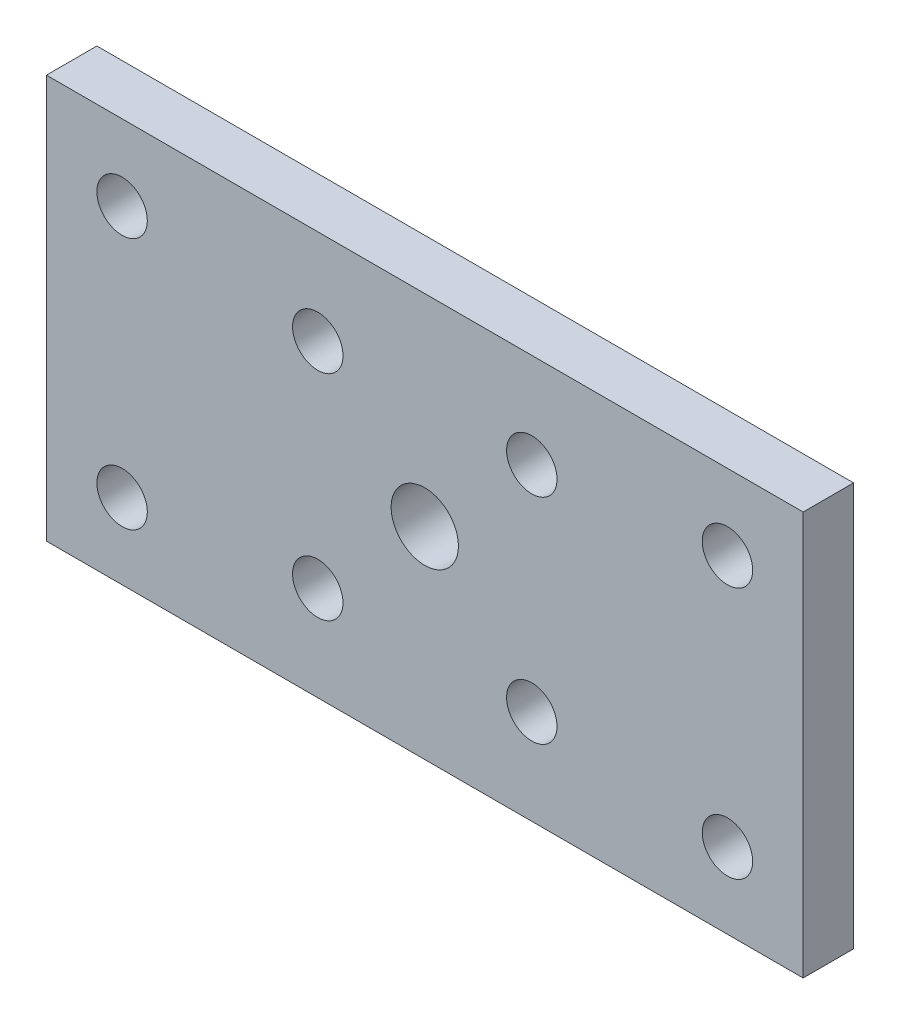
ISO-10303-21;
HEADER;
FILE_DESCRIPTION(('STEP AP214'),'2;1');
FILE_NAME('part.step','',(''),(''),'','','');
FILE_SCHEMA(('AUTOMOTIVE_DESIGN { 1 0 10303 214 1 1 1 1 }'));
ENDSEC;
DATA;
#1=APPLICATION_CONTEXT('core data for automotive mechanical design processes');
#2=APPLICATION_PROTOCOL_DEFINITION('international standard','automotive_design',2000,#1);
#3=PRODUCT_CONTEXT('',#1,'mechanical');
#4=PRODUCT('Part','Part','',(#3));
#5=PRODUCT_RELATED_PRODUCT_CATEGORY('part','',(#4));
#6=PRODUCT_DEFINITION_FORMATION('','',#4);
#7=PRODUCT_DEFINITION_CONTEXT('part definition',#1,'design');
#8=PRODUCT_DEFINITION('design','',#6,#7);
#9=PRODUCT_DEFINITION_SHAPE('','',#8);
#10=(LENGTH_UNIT() NAMED_UNIT(*) SI_UNIT(.MILLI.,.METRE.));
#11=(NAMED_UNIT(*) PLANE_ANGLE_UNIT() SI_UNIT($,.RADIAN.));
#12=(NAMED_UNIT(*) SI_UNIT($,.STERADIAN.) SOLID_ANGLE_UNIT());
#13=UNCERTAINTY_MEASURE_WITH_UNIT(LENGTH_MEASURE(1.E-05),#10,'distance_accuracy_value','');
#14=(GEOMETRIC_REPRESENTATION_CONTEXT(3) GLOBAL_UNCERTAINTY_ASSIGNED_CONTEXT((#13)) GLOBAL_UNIT_ASSIGNED_CONTEXT((#10,
#11,#12)) REPRESENTATION_CONTEXT('',''));
#15=CARTESIAN_POINT('',(0.,0.,0.));
#16=DIRECTION('',(0.,0.,1.));
#17=DIRECTION('',(1.,0.,0.));
#18=AXIS2_PLACEMENT_3D('',#15,#16,#17);
#19=CARTESIAN_POINT('',(0.,0.,3.));
#20=DIRECTION('',(0.,0.,1.));
#21=DIRECTION('',(1.,0.,0.));
#22=AXIS2_PLACEMENT_3D('',#19,#20,#21);
#23=PLANE('',#22);
#24=CARTESIAN_POINT('',(133.4855939853,225.0370579951,3.));
#25=DIRECTION('',(0.,0.,1.));
#26=DIRECTION('',(1.,0.,0.));
#27=AXIS2_PLACEMENT_3D('',#24,#25,#26);
#28=CIRCLE('',#27,1.5);
#29=CARTESIAN_POINT('',(134.9855939853,225.0370579951,3.));
#30=VERTEX_POINT('',#29);
#31=EDGE_CURVE('E151',#30,#30,#28,.T.);
#32=ORIENTED_EDGE('',*,*,#31,.F.);
#33=EDGE_LOOP('',(#32));
#34=FACE_BOUND('',#33,.T.);
#35=CARTESIAN_POINT('',(97.4855939853,225.0370666408,3.));
#36=DIRECTION('',(0.,0.,1.));
#37=DIRECTION('',(1.,0.,0.));
#38=AXIS2_PLACEMENT_3D('',#35,#36,#37);
#39=CIRCLE('',#38,1.5);
#40=CARTESIAN_POINT('',(98.9855939853,225.0370666408,3.));
#41=VERTEX_POINT('',#40);
#42=EDGE_CURVE('E139',#41,#41,#39,.T.);
#43=ORIENTED_EDGE('',*,*,#42,.F.);
#44=EDGE_LOOP('',(#43));
#45=FACE_BOUND('',#44,.T.);
#46=CARTESIAN_POINT('',(109.1216329546,211.1731012873,3.));
#47=DIRECTION('',(0.,0.,1.));
#48=DIRECTION('',(1.,0.,0.));
#49=AXIS2_PLACEMENT_3D('',#46,#47,#48);
#50=CIRCLE('',#49,1.5);
#51=CARTESIAN_POINT('',(110.6216329546,211.1731012873,3.));
#52=VERTEX_POINT('',#51);
#53=EDGE_CURVE('E127',#52,#52,#50,.T.);
#54=ORIENTED_EDGE('',*,*,#53,.F.);
#55=EDGE_LOOP('',(#54));
#56=FACE_BOUND('',#55,.T.);
#57=CARTESIAN_POINT('',(121.849555016,211.1731012873,3.));
#58=DIRECTION('',(0.,0.,1.));
#59=DIRECTION('',(1.,0.,0.));
#60=AXIS2_PLACEMENT_3D('',#57,#58,#59);
#61=CIRCLE('',#60,1.5);
#62=CARTESIAN_POINT('',(123.349555016,211.1731012873,3.));
#63=VERTEX_POINT('',#62);
#64=EDGE_CURVE('E115',#63,#63,#61,.T.);
#65=ORIENTED_EDGE('',*,*,#64,.F.);
#66=EDGE_LOOP('',(#65));
#67=FACE_BOUND('',#66,.T.);
#68=DIRECTION('',(0.,-1.,0.));
#69=VECTOR('',#68,1.);
#70=CARTESIAN_POINT('',(92.9855939853,229.5370666408,3.));
#71=LINE('',#70,#69);
#72=CARTESIAN_POINT('',(92.9855939853,229.5370666408,3.));
#73=VERTEX_POINT('',#72);
#74=CARTESIAN_POINT('',(92.9855939853,205.5370666408,3.));
#75=VERTEX_POINT('',#74);
#76=EDGE_CURVE('E85',#73,#75,#71,.T.);
#77=ORIENTED_EDGE('',*,*,#76,.T.);
#78=DIRECTION('',(0.999999999999982,-1.92126665811263E-07,0.));
#79=VECTOR('',#78,1.);
#80=CARTESIAN_POINT('',(92.9855939853,205.5370666408,3.));
#81=LINE('',#80,#79);
#82=CARTESIAN_POINT('',(137.9855939853,205.5370579951,3.));
#83=VERTEX_POINT('',#82);
#84=EDGE_CURVE('E80',#75,#83,#81,.T.);
#85=ORIENTED_EDGE('',*,*,#84,.T.);
#86=DIRECTION('',(0.,1.,0.));
#87=VECTOR('',#86,1.);
#88=CARTESIAN_POINT('',(137.9855939853,205.5370579951,3.));
#89=LINE('',#88,#87);
#90=CARTESIAN_POINT('',(137.9855939853,229.5370579951,3.));
#91=VERTEX_POINT('',#90);
#92=EDGE_CURVE('E83',#83,#91,#89,.T.);
#93=ORIENTED_EDGE('',*,*,#92,.T.);
#94=DIRECTION('',(-0.999999999999982,1.92126666428054E-07,0.));
#95=VECTOR('',#94,1.);
#96=CARTESIAN_POINT('',(92.9855939853,229.5370666408,3.));
#97=LINE('',#96,#95);
#98=EDGE_CURVE('E50',#91,#73,#97,.T.);
#99=ORIENTED_EDGE('',*,*,#98,.T.);
#100=EDGE_LOOP('',(#77,#85,#93,#99));
#101=FACE_BOUND('',#100,.T.);
#102=CARTESIAN_POINT('',(109.1216329546,223.9010233486,3.));
#103=DIRECTION('',(0.,0.,1.));
#104=DIRECTION('',(1.,0.,0.));
#105=AXIS2_PLACEMENT_3D('',#102,#103,#104);
#106=CIRCLE('',#105,1.5);
#107=CARTESIAN_POINT('',(110.6216329546,223.9010233486,3.));
#108=VERTEX_POINT('',#107);
#109=EDGE_CURVE('E100',#108,#108,#106,.T.);
#110=ORIENTED_EDGE('',*,*,#109,.F.);
#111=EDGE_LOOP('',(#110));
#112=FACE_BOUND('',#111,.T.);
#113=CARTESIAN_POINT('',(121.849555016,223.9010233486,3.));
#114=DIRECTION('',(0.,0.,1.));
#115=DIRECTION('',(1.,0.,0.));
#116=AXIS2_PLACEMENT_3D('',#113,#114,#115);
#117=CIRCLE('',#116,1.5);
#118=CARTESIAN_POINT('',(123.349555016,223.9010233486,3.));
#119=VERTEX_POINT('',#118);
#120=EDGE_CURVE('E121',#119,#119,#117,.T.);
#121=ORIENTED_EDGE('',*,*,#120,.F.);
#122=EDGE_LOOP('',(#121));
#123=FACE_BOUND('',#122,.T.);
#124=CARTESIAN_POINT('',(115.4855939853,217.537062318,3.));
#125=DIRECTION('',(0.,0.,1.));
#126=DIRECTION('',(1.,0.,0.));
#127=AXIS2_PLACEMENT_3D('',#124,#125,#126);
#128=CIRCLE('',#127,2.);
#129=CARTESIAN_POINT('',(117.4855939853,217.537062318,3.));
#130=VERTEX_POINT('',#129);
#131=EDGE_CURVE('E133',#130,#130,#128,.T.);
#132=ORIENTED_EDGE('',*,*,#131,.F.);
#133=EDGE_LOOP('',(#132));
#134=FACE_BOUND('',#133,.T.);
#135=CARTESIAN_POINT('',(97.4855939853,210.0370666408,3.));
#136=DIRECTION('',(0.,0.,1.));
#137=DIRECTION('',(1.,0.,0.));
#138=AXIS2_PLACEMENT_3D('',#135,#136,#137);
#139=CIRCLE('',#138,1.5);
#140=CARTESIAN_POINT('',(98.9855939853,210.0370666408,3.));
#141=VERTEX_POINT('',#140);
#142=EDGE_CURVE('E145',#141,#141,#139,.T.);
#143=ORIENTED_EDGE('',*,*,#142,.F.);
#144=EDGE_LOOP('',(#143));
#145=FACE_BOUND('',#144,.T.);
#146=CARTESIAN_POINT('',(133.4855939853,210.0370579951,3.));
#147=DIRECTION('',(0.,0.,1.));
#148=DIRECTION('',(1.,0.,0.));
#149=AXIS2_PLACEMENT_3D('',#146,#147,#148);
#150=CIRCLE('',#149,1.5);
#151=CARTESIAN_POINT('',(134.9855939853,210.0370579951,3.));
#152=VERTEX_POINT('',#151);
#153=EDGE_CURVE('E157',#152,#152,#150,.T.);
#154=ORIENTED_EDGE('',*,*,#153,.F.);
#155=EDGE_LOOP('',(#154));
#156=FACE_BOUND('',#155,.T.);
#157=ADVANCED_FACE('F33',(#34,#45,#56,#67,#101,#112,#123,#134,#145,#156),#23,.T.);
#158=CARTESIAN_POINT('',(0.,0.,0.));
#159=DIRECTION('',(0.,0.,1.));
#160=DIRECTION('',(1.,0.,0.));
#161=AXIS2_PLACEMENT_3D('',#158,#159,#160);
#162=PLANE('',#161);
#163=CARTESIAN_POINT('',(133.4855939853,225.0370579951,0.));
#164=DIRECTION('',(0.,0.,1.));
#165=DIRECTION('',(1.,0.,0.));
#166=AXIS2_PLACEMENT_3D('',#163,#164,#165);
#167=CIRCLE('',#166,1.5);
#168=CARTESIAN_POINT('',(134.9855939853,225.0370579951,0.));
#169=VERTEX_POINT('',#168);
#170=EDGE_CURVE('E154',#169,#169,#167,.T.);
#171=ORIENTED_EDGE('',*,*,#170,.T.);
#172=EDGE_LOOP('',(#171));
#173=FACE_BOUND('',#172,.T.);
#174=CARTESIAN_POINT('',(97.4855939853,225.0370666408,0.));
#175=DIRECTION('',(0.,0.,1.));
#176=DIRECTION('',(1.,0.,0.));
#177=AXIS2_PLACEMENT_3D('',#174,#175,#176);
#178=CIRCLE('',#177,1.5);
#179=CARTESIAN_POINT('',(98.9855939853,225.0370666408,0.));
#180=VERTEX_POINT('',#179);
#181=EDGE_CURVE('E142',#180,#180,#178,.T.);
#182=ORIENTED_EDGE('',*,*,#181,.T.);
#183=EDGE_LOOP('',(#182));
#184=FACE_BOUND('',#183,.T.);
#185=CARTESIAN_POINT('',(109.1216329546,211.1731012873,0.));
#186=DIRECTION('',(0.,0.,1.));
#187=DIRECTION('',(1.,0.,0.));
#188=AXIS2_PLACEMENT_3D('',#185,#186,#187);
#189=CIRCLE('',#188,1.5);
#190=CARTESIAN_POINT('',(110.6216329546,211.1731012873,0.));
#191=VERTEX_POINT('',#190);
#192=EDGE_CURVE('E130',#191,#191,#189,.T.);
#193=ORIENTED_EDGE('',*,*,#192,.T.);
#194=EDGE_LOOP('',(#193));
#195=FACE_BOUND('',#194,.T.);
#196=CARTESIAN_POINT('',(121.849555016,211.1731012873,0.));
#197=DIRECTION('',(0.,0.,1.));
#198=DIRECTION('',(1.,0.,0.));
#199=AXIS2_PLACEMENT_3D('',#196,#197,#198);
#200=CIRCLE('',#199,1.5);
#201=CARTESIAN_POINT('',(123.349555016,211.1731012873,0.));
#202=VERTEX_POINT('',#201);
#203=EDGE_CURVE('E118',#202,#202,#200,.T.);
#204=ORIENTED_EDGE('',*,*,#203,.T.);
#205=EDGE_LOOP('',(#204));
#206=FACE_BOUND('',#205,.T.);
#207=DIRECTION('',(0.,-1.,0.));
#208=VECTOR('',#207,1.);
#209=CARTESIAN_POINT('',(92.9855939853,229.5370666408,0.));
#210=LINE('',#209,#208);
#211=CARTESIAN_POINT('',(92.9855939853,229.5370666408,0.));
#212=VERTEX_POINT('',#211);
#213=CARTESIAN_POINT('',(92.9855939853,205.5370666408,0.));
#214=VERTEX_POINT('',#213);
#215=EDGE_CURVE('E97',#212,#214,#210,.T.);
#216=ORIENTED_EDGE('',*,*,#215,.F.);
#217=DIRECTION('',(-0.999999999999982,1.92126666428054E-07,0.));
#218=VECTOR('',#217,1.);
#219=CARTESIAN_POINT('',(92.9855939853,229.5370666408,0.));
#220=LINE('',#219,#218);
#221=CARTESIAN_POINT('',(137.9855939853,229.5370579951,0.));
#222=VERTEX_POINT('',#221);
#223=EDGE_CURVE('E73',#222,#212,#220,.T.);
#224=ORIENTED_EDGE('',*,*,#223,.F.);
#225=DIRECTION('',(0.,1.,0.));
#226=VECTOR('',#225,1.);
#227=CARTESIAN_POINT('',(137.9855939853,205.5370579951,0.));
#228=LINE('',#227,#226);
#229=CARTESIAN_POINT('',(137.9855939853,205.5370579951,0.));
#230=VERTEX_POINT('',#229);
#231=EDGE_CURVE('E67',#230,#222,#228,.T.);
#232=ORIENTED_EDGE('',*,*,#231,.F.);
#233=DIRECTION('',(0.999999999999982,-1.92126665811263E-07,0.));
#234=VECTOR('',#233,1.);
#235=CARTESIAN_POINT('',(92.9855939853,205.5370666408,0.));
#236=LINE('',#235,#234);
#237=EDGE_CURVE('E89',#214,#230,#236,.T.);
#238=ORIENTED_EDGE('',*,*,#237,.F.);
#239=EDGE_LOOP('',(#216,#224,#232,#238));
#240=FACE_BOUND('',#239,.T.);
#241=CARTESIAN_POINT('',(109.1216329546,223.9010233486,0.));
#242=DIRECTION('',(0.,0.,1.));
#243=DIRECTION('',(1.,0.,0.));
#244=AXIS2_PLACEMENT_3D('',#241,#242,#243);
#245=CIRCLE('',#244,1.5);
#246=CARTESIAN_POINT('',(110.6216329546,223.9010233486,0.));
#247=VERTEX_POINT('',#246);
#248=EDGE_CURVE('E112',#247,#247,#245,.T.);
#249=ORIENTED_EDGE('',*,*,#248,.T.);
#250=EDGE_LOOP('',(#249));
#251=FACE_BOUND('',#250,.T.);
#252=CARTESIAN_POINT('',(121.849555016,223.9010233486,0.));
#253=DIRECTION('',(0.,0.,1.));
#254=DIRECTION('',(1.,0.,0.));
#255=AXIS2_PLACEMENT_3D('',#252,#253,#254);
#256=CIRCLE('',#255,1.5);
#257=CARTESIAN_POINT('',(123.349555016,223.9010233486,0.));
#258=VERTEX_POINT('',#257);
#259=EDGE_CURVE('E124',#258,#258,#256,.T.);
#260=ORIENTED_EDGE('',*,*,#259,.T.);
#261=EDGE_LOOP('',(#260));
#262=FACE_BOUND('',#261,.T.);
#263=CARTESIAN_POINT('',(115.4855939853,217.537062318,0.));
#264=DIRECTION('',(0.,0.,1.));
#265=DIRECTION('',(1.,0.,0.));
#266=AXIS2_PLACEMENT_3D('',#263,#264,#265);
#267=CIRCLE('',#266,2.);
#268=CARTESIAN_POINT('',(117.4855939853,217.537062318,0.));
#269=VERTEX_POINT('',#268);
#270=EDGE_CURVE('E136',#269,#269,#267,.T.);
#271=ORIENTED_EDGE('',*,*,#270,.T.);
#272=EDGE_LOOP('',(#271));
#273=FACE_BOUND('',#272,.T.);
#274=CARTESIAN_POINT('',(97.4855939853,210.0370666408,0.));
#275=DIRECTION('',(0.,0.,1.));
#276=DIRECTION('',(1.,0.,0.));
#277=AXIS2_PLACEMENT_3D('',#274,#275,#276);
#278=CIRCLE('',#277,1.5);
#279=CARTESIAN_POINT('',(98.9855939853,210.0370666408,0.));
#280=VERTEX_POINT('',#279);
#281=EDGE_CURVE('E148',#280,#280,#278,.T.);
#282=ORIENTED_EDGE('',*,*,#281,.T.);
#283=EDGE_LOOP('',(#282));
#284=FACE_BOUND('',#283,.T.);
#285=CARTESIAN_POINT('',(133.4855939853,210.0370579951,0.));
#286=DIRECTION('',(0.,0.,1.));
#287=DIRECTION('',(1.,0.,0.));
#288=AXIS2_PLACEMENT_3D('',#285,#286,#287);
#289=CIRCLE('',#288,1.5);
#290=CARTESIAN_POINT('',(134.9855939853,210.0370579951,0.));
#291=VERTEX_POINT('',#290);
#292=EDGE_CURVE('E160',#291,#291,#289,.T.);
#293=ORIENTED_EDGE('',*,*,#292,.T.);
#294=EDGE_LOOP('',(#293));
#295=FACE_BOUND('',#294,.T.);
#296=ADVANCED_FACE('F108',(#173,#184,#195,#206,#240,#251,#262,#273,#284,#295),#162,.F.);
#297=CARTESIAN_POINT('',(92.9855939853,229.5370666408,3.));
#298=DIRECTION('',(1.,0.,0.));
#299=DIRECTION('',(0.,0.,-1.));
#300=AXIS2_PLACEMENT_3D('',#297,#298,#299);
#301=PLANE('',#300);
#302=ORIENTED_EDGE('',*,*,#215,.T.);
#303=DIRECTION('',(0.,0.,-1.));
#304=VECTOR('',#303,1.);
#305=CARTESIAN_POINT('',(92.9855939853,205.5370666408,3.));
#306=LINE('',#305,#304);
#307=EDGE_CURVE('E11',#75,#214,#306,.T.);
#308=ORIENTED_EDGE('',*,*,#307,.F.);
#309=ORIENTED_EDGE('',*,*,#76,.F.);
#310=DIRECTION('',(0.,0.,-1.));
#311=VECTOR('',#310,1.);
#312=CARTESIAN_POINT('',(92.9855939853,229.5370666408,3.));
#313=LINE('',#312,#311);
#314=EDGE_CURVE('E93',#73,#212,#313,.T.);
#315=ORIENTED_EDGE('',*,*,#314,.T.);
#316=EDGE_LOOP('',(#302,#308,#309,#315));
#317=FACE_BOUND('',#316,.T.);
#318=ADVANCED_FACE('F35',(#317),#301,.F.);
#319=CARTESIAN_POINT('',(92.9855939853,205.5370666408,3.));
#320=DIRECTION('',(1.92126665811263E-07,0.999999999999981,0.));
#321=DIRECTION('',(-0.999999999999982,1.92126665811263E-07,0.));
#322=AXIS2_PLACEMENT_3D('',#319,#320,#321);
#323=PLANE('',#322);
#324=ORIENTED_EDGE('',*,*,#237,.T.);
#325=DIRECTION('',(0.,0.,-1.));
#326=VECTOR('',#325,1.);
#327=CARTESIAN_POINT('',(137.9855939853,205.5370579951,3.));
#328=LINE('',#327,#326);
#329=EDGE_CURVE('E42',#83,#230,#328,.T.);
#330=ORIENTED_EDGE('',*,*,#329,.F.);
#331=ORIENTED_EDGE('',*,*,#84,.F.);
#332=ORIENTED_EDGE('',*,*,#307,.T.);
#333=EDGE_LOOP('',(#324,#330,#331,#332));
#334=FACE_BOUND('',#333,.T.);
#335=ADVANCED_FACE('F88',(#334),#323,.F.);
#336=CARTESIAN_POINT('',(137.9855939853,205.5370579951,3.));
#337=DIRECTION('',(-1.,0.,0.));
#338=DIRECTION('',(0.,0.,1.));
#339=AXIS2_PLACEMENT_3D('',#336,#337,#338);
#340=PLANE('',#339);
#341=ORIENTED_EDGE('',*,*,#231,.T.);
#342=DIRECTION('',(0.,0.,-1.));
#343=VECTOR('',#342,1.);
#344=CARTESIAN_POINT('',(137.9855939853,229.5370579951,3.));
#345=LINE('',#344,#343);
#346=EDGE_CURVE('E90',#91,#222,#345,.T.);
#347=ORIENTED_EDGE('',*,*,#346,.F.);
#348=ORIENTED_EDGE('',*,*,#92,.F.);
#349=ORIENTED_EDGE('',*,*,#329,.T.);
#350=EDGE_LOOP('',(#341,#347,#348,#349));
#351=FACE_BOUND('',#350,.T.);
#352=ADVANCED_FACE('F91',(#351),#340,.F.);
#353=CARTESIAN_POINT('',(92.9855939853,229.5370666408,3.));
#354=DIRECTION('',(-1.92126666428053E-07,-0.999999999999981,0.));
#355=DIRECTION('',(0.999999999999982,-1.92126666428054E-07,0.));
#356=AXIS2_PLACEMENT_3D('',#353,#354,#355);
#357=PLANE('',#356);
#358=ORIENTED_EDGE('',*,*,#223,.T.);
#359=ORIENTED_EDGE('',*,*,#314,.F.);
#360=ORIENTED_EDGE('',*,*,#98,.F.);
#361=ORIENTED_EDGE('',*,*,#346,.T.);
#362=EDGE_LOOP('',(#358,#359,#360,#361));
#363=FACE_BOUND('',#362,.T.);
#364=ADVANCED_FACE('F105',(#363),#357,.F.);
#365=CARTESIAN_POINT('',(109.1216329546,223.9010233486,3.));
#366=DIRECTION('',(0.,0.,-1.));
#367=DIRECTION('',(-1.,0.,0.));
#368=AXIS2_PLACEMENT_3D('',#365,#366,#367);
#369=CYLINDRICAL_SURFACE('',#368,1.5);
#370=ORIENTED_EDGE('',*,*,#109,.T.);
#371=EDGE_LOOP('',(#370));
#372=FACE_BOUND('',#371,.T.);
#373=ORIENTED_EDGE('',*,*,#248,.F.);
#374=EDGE_LOOP('',(#373));
#375=FACE_BOUND('',#374,.T.);
#376=ADVANCED_FACE('F180',(#372,#375),#369,.F.);
#377=CARTESIAN_POINT('',(121.849555016,211.1731012873,3.));
#378=DIRECTION('',(0.,0.,-1.));
#379=DIRECTION('',(-1.,0.,0.));
#380=AXIS2_PLACEMENT_3D('',#377,#378,#379);
#381=CYLINDRICAL_SURFACE('',#380,1.5);
#382=ORIENTED_EDGE('',*,*,#64,.T.);
#383=EDGE_LOOP('',(#382));
#384=FACE_BOUND('',#383,.T.);
#385=ORIENTED_EDGE('',*,*,#203,.F.);
#386=EDGE_LOOP('',(#385));
#387=FACE_BOUND('',#386,.T.);
#388=ADVANCED_FACE('F226',(#384,#387),#381,.F.);
#389=CARTESIAN_POINT('',(121.849555016,223.9010233486,3.));
#390=DIRECTION('',(0.,0.,-1.));
#391=DIRECTION('',(-1.,0.,0.));
#392=AXIS2_PLACEMENT_3D('',#389,#390,#391);
#393=CYLINDRICAL_SURFACE('',#392,1.5);
#394=ORIENTED_EDGE('',*,*,#120,.T.);
#395=EDGE_LOOP('',(#394));
#396=FACE_BOUND('',#395,.T.);
#397=ORIENTED_EDGE('',*,*,#259,.F.);
#398=EDGE_LOOP('',(#397));
#399=FACE_BOUND('',#398,.T.);
#400=ADVANCED_FACE('F234',(#396,#399),#393,.F.);
#401=CARTESIAN_POINT('',(109.1216329546,211.1731012873,3.));
#402=DIRECTION('',(0.,0.,-1.));
#403=DIRECTION('',(-1.,0.,0.));
#404=AXIS2_PLACEMENT_3D('',#401,#402,#403);
#405=CYLINDRICAL_SURFACE('',#404,1.5);
#406=ORIENTED_EDGE('',*,*,#53,.T.);
#407=EDGE_LOOP('',(#406));
#408=FACE_BOUND('',#407,.T.);
#409=ORIENTED_EDGE('',*,*,#192,.F.);
#410=EDGE_LOOP('',(#409));
#411=FACE_BOUND('',#410,.T.);
#412=ADVANCED_FACE('F242',(#408,#411),#405,.F.);
#413=CARTESIAN_POINT('',(115.4855939853,217.537062318,3.));
#414=DIRECTION('',(0.,0.,-1.));
#415=DIRECTION('',(-1.,0.,0.));
#416=AXIS2_PLACEMENT_3D('',#413,#414,#415);
#417=CYLINDRICAL_SURFACE('',#416,2.);
#418=ORIENTED_EDGE('',*,*,#131,.T.);
#419=EDGE_LOOP('',(#418));
#420=FACE_BOUND('',#419,.T.);
#421=ORIENTED_EDGE('',*,*,#270,.F.);
#422=EDGE_LOOP('',(#421));
#423=FACE_BOUND('',#422,.T.);
#424=ADVANCED_FACE('F251',(#420,#423),#417,.F.);
#425=CARTESIAN_POINT('',(97.4855939853,225.0370666408,3.));
#426=DIRECTION('',(0.,0.,-1.));
#427=DIRECTION('',(-1.,0.,0.));
#428=AXIS2_PLACEMENT_3D('',#425,#426,#427);
#429=CYLINDRICAL_SURFACE('',#428,1.5);
#430=ORIENTED_EDGE('',*,*,#42,.T.);
#431=EDGE_LOOP('',(#430));
#432=FACE_BOUND('',#431,.T.);
#433=ORIENTED_EDGE('',*,*,#181,.F.);
#434=EDGE_LOOP('',(#433));
#435=FACE_BOUND('',#434,.T.);
#436=ADVANCED_FACE('F260',(#432,#435),#429,.F.);
#437=CARTESIAN_POINT('',(97.4855939853,210.0370666408,3.));
#438=DIRECTION('',(0.,0.,-1.));
#439=DIRECTION('',(-1.,0.,0.));
#440=AXIS2_PLACEMENT_3D('',#437,#438,#439);
#441=CYLINDRICAL_SURFACE('',#440,1.5);
#442=ORIENTED_EDGE('',*,*,#142,.T.);
#443=EDGE_LOOP('',(#442));
#444=FACE_BOUND('',#443,.T.);
#445=ORIENTED_EDGE('',*,*,#281,.F.);
#446=EDGE_LOOP('',(#445));
#447=FACE_BOUND('',#446,.T.);
#448=ADVANCED_FACE('F269',(#444,#447),#441,.F.);
#449=CARTESIAN_POINT('',(133.4855939853,225.0370579951,3.));
#450=DIRECTION('',(0.,0.,-1.));
#451=DIRECTION('',(-1.,0.,0.));
#452=AXIS2_PLACEMENT_3D('',#449,#450,#451);
#453=CYLINDRICAL_SURFACE('',#452,1.5);
#454=ORIENTED_EDGE('',*,*,#31,.T.);
#455=EDGE_LOOP('',(#454));
#456=FACE_BOUND('',#455,.T.);
#457=ORIENTED_EDGE('',*,*,#170,.F.);
#458=EDGE_LOOP('',(#457));
#459=FACE_BOUND('',#458,.T.);
#460=ADVANCED_FACE('F278',(#456,#459),#453,.F.);
#461=CARTESIAN_POINT('',(133.4855939853,210.0370579951,3.));
#462=DIRECTION('',(0.,0.,-1.));
#463=DIRECTION('',(-1.,0.,0.));
#464=AXIS2_PLACEMENT_3D('',#461,#462,#463);
#465=CYLINDRICAL_SURFACE('',#464,1.5);
#466=ORIENTED_EDGE('',*,*,#153,.T.);
#467=EDGE_LOOP('',(#466));
#468=FACE_BOUND('',#467,.T.);
#469=ORIENTED_EDGE('',*,*,#292,.F.);
#470=EDGE_LOOP('',(#469));
#471=FACE_BOUND('',#470,.T.);
#472=ADVANCED_FACE('F166',(#468,#471),#465,.F.);
#473=CLOSED_SHELL('',(#157,#296,#318,#335,#352,#364,#376,#388,#400,#412,#424,#436,#448,#460,#472));
#474=MANIFOLD_SOLID_BREP('B2',#473);
#475=ADVANCED_BREP_SHAPE_REPRESENTATION('',(#18,#474),#14);
#476=SHAPE_DEFINITION_REPRESENTATION(#9,#475);
ENDSEC;
END-ISO-10303-21;
